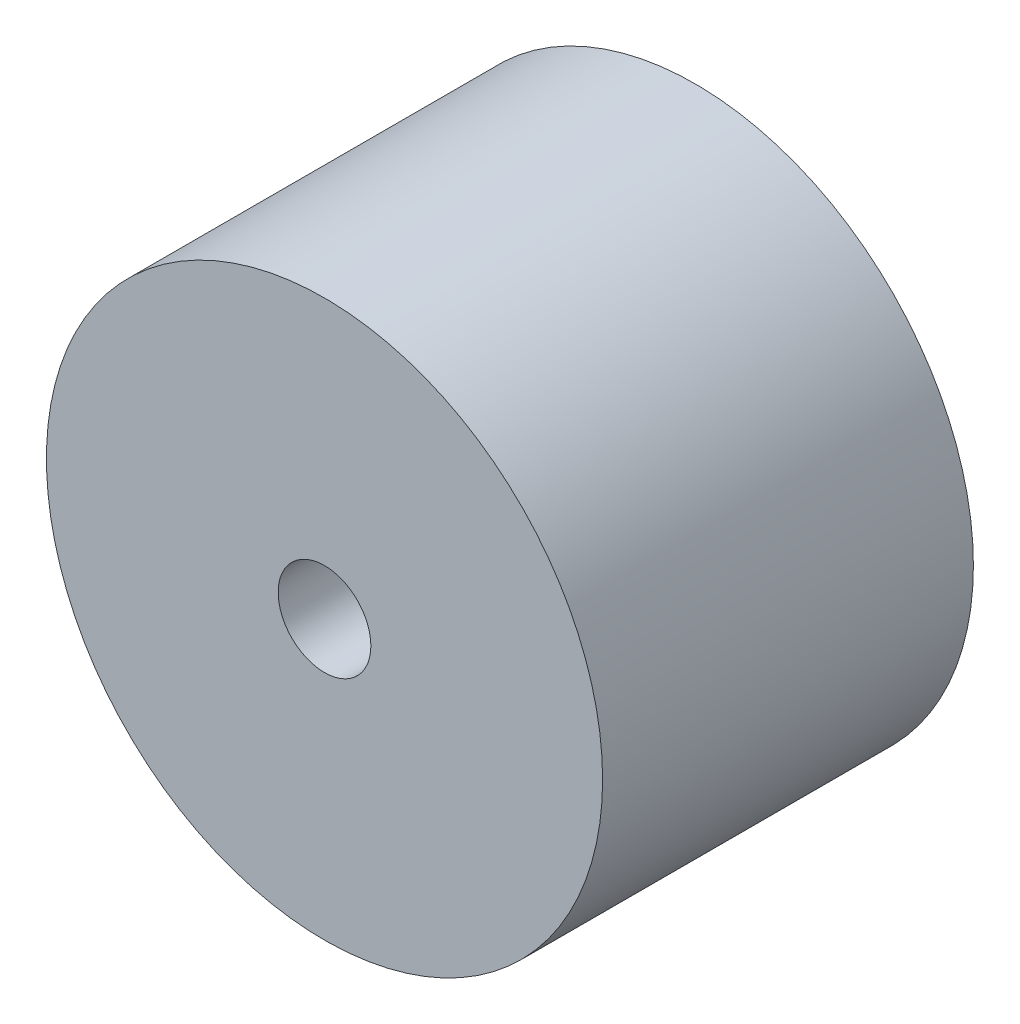
ISO-10303-21;
HEADER;
FILE_DESCRIPTION(('STEP AP214'),'2;1');
FILE_NAME('part.step','',(''),(''),'','','');
FILE_SCHEMA(('AUTOMOTIVE_DESIGN { 1 0 10303 214 1 1 1 1 }'));
ENDSEC;
DATA;
#1=APPLICATION_CONTEXT('core data for automotive mechanical design processes');
#2=APPLICATION_PROTOCOL_DEFINITION('international standard','automotive_design',2000,#1);
#3=PRODUCT_CONTEXT('',#1,'mechanical');
#4=PRODUCT('Part','Part','',(#3));
#5=PRODUCT_RELATED_PRODUCT_CATEGORY('part','',(#4));
#6=PRODUCT_DEFINITION_FORMATION('','',#4);
#7=PRODUCT_DEFINITION_CONTEXT('part definition',#1,'design');
#8=PRODUCT_DEFINITION('design','',#6,#7);
#9=PRODUCT_DEFINITION_SHAPE('','',#8);
#10=(LENGTH_UNIT() NAMED_UNIT(*) SI_UNIT(.MILLI.,.METRE.));
#11=(NAMED_UNIT(*) PLANE_ANGLE_UNIT() SI_UNIT($,.RADIAN.));
#12=(NAMED_UNIT(*) SI_UNIT($,.STERADIAN.) SOLID_ANGLE_UNIT());
#13=UNCERTAINTY_MEASURE_WITH_UNIT(LENGTH_MEASURE(1.E-05),#10,'distance_accuracy_value','');
#14=(GEOMETRIC_REPRESENTATION_CONTEXT(3) GLOBAL_UNCERTAINTY_ASSIGNED_CONTEXT((#13)) GLOBAL_UNIT_ASSIGNED_CONTEXT((#10,
#11,#12)) REPRESENTATION_CONTEXT('',''));
#15=CARTESIAN_POINT('',(0.,0.,0.));
#16=DIRECTION('',(0.,0.,1.));
#17=DIRECTION('',(1.,0.,0.));
#18=AXIS2_PLACEMENT_3D('',#15,#16,#17);
#19=CARTESIAN_POINT('',(0.,0.,24.));
#20=DIRECTION('',(0.,0.,1.));
#21=DIRECTION('',(1.,0.,0.));
#22=AXIS2_PLACEMENT_3D('',#19,#20,#21);
#23=PLANE('',#22);
#24=CARTESIAN_POINT('',(0.,0.,24.));
#25=DIRECTION('',(0.,0.,1.));
#26=DIRECTION('',(1.,0.,0.));
#27=AXIS2_PLACEMENT_3D('',#24,#25,#26);
#28=CIRCLE('',#27,18.);
#29=CARTESIAN_POINT('',(18.,0.,24.));
#30=VERTEX_POINT('',#29);
#31=EDGE_CURVE('E10',#30,#30,#28,.T.);
#32=ORIENTED_EDGE('',*,*,#31,.T.);
#33=EDGE_LOOP('',(#32));
#34=FACE_BOUND('',#33,.T.);
#35=CARTESIAN_POINT('',(0.,0.,24.));
#36=DIRECTION('',(0.,0.,1.));
#37=DIRECTION('',(1.,0.,0.));
#38=AXIS2_PLACEMENT_3D('',#35,#36,#37);
#39=CIRCLE('',#38,3.);
#40=CARTESIAN_POINT('',(3.,0.,24.));
#41=VERTEX_POINT('',#40);
#42=EDGE_CURVE('E49',#41,#41,#39,.T.);
#43=ORIENTED_EDGE('',*,*,#42,.F.);
#44=EDGE_LOOP('',(#43));
#45=FACE_BOUND('',#44,.T.);
#46=ADVANCED_FACE('F39',(#34,#45),#23,.T.);
#47=CARTESIAN_POINT('',(0.,0.,0.));
#48=DIRECTION('',(0.,0.,1.));
#49=DIRECTION('',(1.,0.,0.));
#50=AXIS2_PLACEMENT_3D('',#47,#48,#49);
#51=PLANE('',#50);
#52=CARTESIAN_POINT('',(0.,0.,0.));
#53=DIRECTION('',(0.,0.,1.));
#54=DIRECTION('',(1.,0.,0.));
#55=AXIS2_PLACEMENT_3D('',#52,#53,#54);
#56=CIRCLE('',#55,18.);
#57=CARTESIAN_POINT('',(18.,0.,0.));
#58=VERTEX_POINT('',#57);
#59=EDGE_CURVE('E43',#58,#58,#56,.T.);
#60=ORIENTED_EDGE('',*,*,#59,.F.);
#61=EDGE_LOOP('',(#60));
#62=FACE_BOUND('',#61,.T.);
#63=CARTESIAN_POINT('',(0.,0.,0.));
#64=DIRECTION('',(0.,0.,1.));
#65=DIRECTION('',(1.,0.,0.));
#66=AXIS2_PLACEMENT_3D('',#63,#64,#65);
#67=CIRCLE('',#66,3.);
#68=CARTESIAN_POINT('',(3.,0.,0.));
#69=VERTEX_POINT('',#68);
#70=EDGE_CURVE('E55',#69,#69,#67,.T.);
#71=ORIENTED_EDGE('',*,*,#70,.T.);
#72=EDGE_LOOP('',(#71));
#73=FACE_BOUND('',#72,.T.);
#74=ADVANCED_FACE('F65',(#62,#73),#51,.F.);
#75=CARTESIAN_POINT('',(0.,0.,24.));
#76=DIRECTION('',(0.,0.,-1.));
#77=DIRECTION('',(-1.,0.,0.));
#78=AXIS2_PLACEMENT_3D('',#75,#76,#77);
#79=CYLINDRICAL_SURFACE('',#78,18.);
#80=ORIENTED_EDGE('',*,*,#31,.F.);
#81=EDGE_LOOP('',(#80));
#82=FACE_BOUND('',#81,.T.);
#83=ORIENTED_EDGE('',*,*,#59,.T.);
#84=EDGE_LOOP('',(#83));
#85=FACE_BOUND('',#84,.T.);
#86=ADVANCED_FACE('F41',(#82,#85),#79,.T.);
#87=CARTESIAN_POINT('',(0.,0.,24.));
#88=DIRECTION('',(0.,0.,-1.));
#89=DIRECTION('',(-1.,0.,0.));
#90=AXIS2_PLACEMENT_3D('',#87,#88,#89);
#91=CYLINDRICAL_SURFACE('',#90,3.);
#92=ORIENTED_EDGE('',*,*,#42,.T.);
#93=EDGE_LOOP('',(#92));
#94=FACE_BOUND('',#93,.T.);
#95=ORIENTED_EDGE('',*,*,#70,.F.);
#96=EDGE_LOOP('',(#95));
#97=FACE_BOUND('',#96,.T.);
#98=ADVANCED_FACE('F59',(#94,#97),#91,.F.);
#99=CLOSED_SHELL('',(#46,#74,#86,#98));
#100=MANIFOLD_SOLID_BREP('B2',#99);
#101=ADVANCED_BREP_SHAPE_REPRESENTATION('',(#18,#100),#14);
#102=SHAPE_DEFINITION_REPRESENTATION(#9,#101);
ENDSEC;
END-ISO-10303-21;
